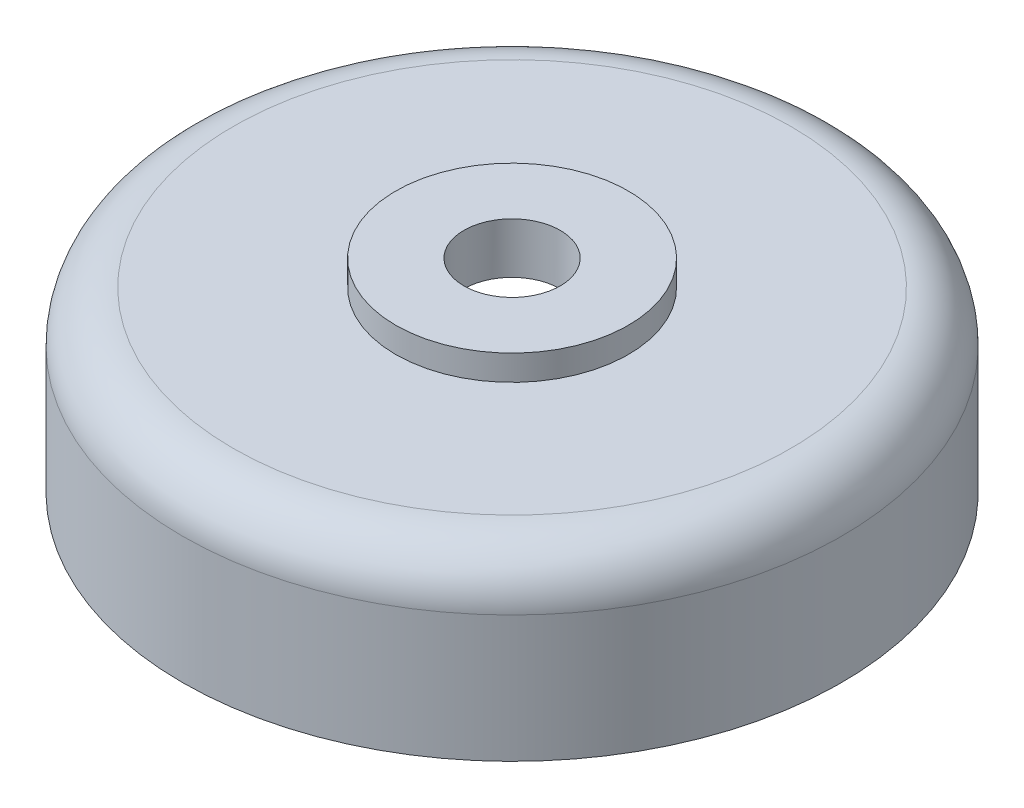
ISO-10303-21;
HEADER;
FILE_DESCRIPTION(('STEP AP214'),'2;1');
FILE_NAME('part.step','',(''),(''),'','','');
FILE_SCHEMA(('AUTOMOTIVE_DESIGN { 1 0 10303 214 1 1 1 1 }'));
ENDSEC;
DATA;
#1=APPLICATION_CONTEXT('core data for automotive mechanical design processes');
#2=APPLICATION_PROTOCOL_DEFINITION('international standard','automotive_design',2000,#1);
#3=PRODUCT_CONTEXT('',#1,'mechanical');
#4=PRODUCT('Part','Part','',(#3));
#5=PRODUCT_RELATED_PRODUCT_CATEGORY('part','',(#4));
#6=PRODUCT_DEFINITION_FORMATION('','',#4);
#7=PRODUCT_DEFINITION_CONTEXT('part definition',#1,'design');
#8=PRODUCT_DEFINITION('design','',#6,#7);
#9=PRODUCT_DEFINITION_SHAPE('','',#8);
#10=(LENGTH_UNIT() NAMED_UNIT(*) SI_UNIT(.MILLI.,.METRE.));
#11=(NAMED_UNIT(*) PLANE_ANGLE_UNIT() SI_UNIT($,.RADIAN.));
#12=(NAMED_UNIT(*) SI_UNIT($,.STERADIAN.) SOLID_ANGLE_UNIT());
#13=UNCERTAINTY_MEASURE_WITH_UNIT(LENGTH_MEASURE(1.E-05),#10,'distance_accuracy_value','');
#14=(GEOMETRIC_REPRESENTATION_CONTEXT(3) GLOBAL_UNCERTAINTY_ASSIGNED_CONTEXT((#13)) GLOBAL_UNIT_ASSIGNED_CONTEXT((#10,
#11,#12)) REPRESENTATION_CONTEXT('',''));
#15=CARTESIAN_POINT('',(0.,0.,0.));
#16=DIRECTION('',(0.,0.,1.));
#17=DIRECTION('',(1.,0.,0.));
#18=AXIS2_PLACEMENT_3D('',#15,#16,#17);
#19=CARTESIAN_POINT('',(0.,-59.,0.));
#20=DIRECTION('',(0.,1.,0.));
#21=DIRECTION('',(0.,0.,1.));
#22=AXIS2_PLACEMENT_3D('',#19,#20,#21);
#23=CYLINDRICAL_SURFACE('',#22,9.5);
#24=CARTESIAN_POINT('',(0.,40.,0.));
#25=DIRECTION('',(0.,1.,0.));
#26=DIRECTION('',(0.,0.,1.));
#27=AXIS2_PLACEMENT_3D('',#24,#25,#26);
#28=CIRCLE('',#27,9.5);
#29=CARTESIAN_POINT('',(0.,40.,9.5));
#30=VERTEX_POINT('',#29);
#31=EDGE_CURVE('E65',#30,#30,#28,.T.);
#32=ORIENTED_EDGE('',*,*,#31,.T.);
#33=EDGE_LOOP('',(#32));
#34=FACE_BOUND('',#33,.T.);
#35=CARTESIAN_POINT('',(0.,30.,0.));
#36=DIRECTION('',(0.,-1.,0.));
#37=DIRECTION('',(0.,0.,-1.));
#38=AXIS2_PLACEMENT_3D('',#35,#36,#37);
#39=CIRCLE('',#38,9.5);
#40=CARTESIAN_POINT('',(0.,30.,-9.5));
#41=VERTEX_POINT('',#40);
#42=EDGE_CURVE('E61',#41,#41,#39,.F.);
#43=ORIENTED_EDGE('',*,*,#42,.F.);
#44=EDGE_LOOP('',(#43));
#45=FACE_BOUND('',#44,.T.);
#46=ADVANCED_FACE('F36',(#34,#45),#23,.F.);
#47=CARTESIAN_POINT('',(0.,35.,0.));
#48=DIRECTION('',(0.,-1.,0.));
#49=DIRECTION('',(0.,0.,-1.));
#50=AXIS2_PLACEMENT_3D('',#47,#48,#49);
#51=CYLINDRICAL_SURFACE('',#50,65.);
#52=CARTESIAN_POINT('',(0.,25.,0.));
#53=DIRECTION('',(0.,1.,0.));
#54=DIRECTION('',(0.,0.,1.));
#55=AXIS2_PLACEMENT_3D('',#52,#53,#54);
#56=CIRCLE('',#55,65.);
#57=CARTESIAN_POINT('',(0.,25.,65.));
#58=VERTEX_POINT('',#57);
#59=EDGE_CURVE('E49',#58,#58,#56,.F.);
#60=ORIENTED_EDGE('',*,*,#59,.T.);
#61=EDGE_LOOP('',(#60));
#62=FACE_BOUND('',#61,.T.);
#63=CARTESIAN_POINT('',(0.,0.,0.));
#64=DIRECTION('',(0.,1.,0.));
#65=DIRECTION('',(0.,0.,1.));
#66=AXIS2_PLACEMENT_3D('',#63,#64,#65);
#67=CIRCLE('',#66,65.);
#68=CARTESIAN_POINT('',(0.,0.,65.));
#69=VERTEX_POINT('',#68);
#70=EDGE_CURVE('E67',#69,#69,#67,.T.);
#71=ORIENTED_EDGE('',*,*,#70,.T.);
#72=EDGE_LOOP('',(#71));
#73=FACE_BOUND('',#72,.T.);
#74=ADVANCED_FACE('F95',(#62,#73),#51,.T.);
#75=CARTESIAN_POINT('',(0.,35.,0.));
#76=DIRECTION('',(0.,1.,0.));
#77=DIRECTION('',(0.,0.,1.));
#78=AXIS2_PLACEMENT_3D('',#75,#76,#77);
#79=PLANE('',#78);
#80=CARTESIAN_POINT('',(0.,35.,0.));
#81=DIRECTION('',(0.,1.,0.));
#82=DIRECTION('',(0.,0.,1.));
#83=AXIS2_PLACEMENT_3D('',#80,#81,#82);
#84=CIRCLE('',#83,55.);
#85=CARTESIAN_POINT('',(0.,35.,55.));
#86=VERTEX_POINT('',#85);
#87=EDGE_CURVE('E54',#86,#86,#84,.T.);
#88=ORIENTED_EDGE('',*,*,#87,.T.);
#89=EDGE_LOOP('',(#88));
#90=FACE_BOUND('',#89,.T.);
#91=CARTESIAN_POINT('',(0.,35.,0.));
#92=DIRECTION('',(0.,1.,0.));
#93=DIRECTION('',(0.,0.,1.));
#94=AXIS2_PLACEMENT_3D('',#91,#92,#93);
#95=CIRCLE('',#94,22.945);
#96=CARTESIAN_POINT('',(0.,35.,22.945));
#97=VERTEX_POINT('',#96);
#98=EDGE_CURVE('E60',#97,#97,#95,.T.);
#99=ORIENTED_EDGE('',*,*,#98,.F.);
#100=EDGE_LOOP('',(#99));
#101=FACE_BOUND('',#100,.T.);
#102=ADVANCED_FACE('F91',(#90,#101),#79,.T.);
#103=CARTESIAN_POINT('',(0.,0.,0.));
#104=DIRECTION('',(0.,1.,0.));
#105=DIRECTION('',(0.,0.,1.));
#106=AXIS2_PLACEMENT_3D('',#103,#104,#105);
#107=PLANE('',#106);
#108=CARTESIAN_POINT('',(0.,0.,0.));
#109=DIRECTION('',(0.,-1.,0.));
#110=DIRECTION('',(0.,0.,-1.));
#111=AXIS2_PLACEMENT_3D('',#108,#109,#110);
#112=CIRCLE('',#111,60.);
#113=CARTESIAN_POINT('',(0.,0.,-60.));
#114=VERTEX_POINT('',#113);
#115=EDGE_CURVE('E66',#114,#114,#112,.T.);
#116=ORIENTED_EDGE('',*,*,#115,.F.);
#117=EDGE_LOOP('',(#116));
#118=FACE_BOUND('',#117,.T.);
#119=ORIENTED_EDGE('',*,*,#70,.F.);
#120=EDGE_LOOP('',(#119));
#121=FACE_BOUND('',#120,.T.);
#122=ADVANCED_FACE('F87',(#118,#121),#107,.F.);
#123=CARTESIAN_POINT('',(0.,40.,0.));
#124=DIRECTION('',(0.,-1.,0.));
#125=DIRECTION('',(0.,0.,-1.));
#126=AXIS2_PLACEMENT_3D('',#123,#124,#125);
#127=CYLINDRICAL_SURFACE('',#126,22.945);
#128=CARTESIAN_POINT('',(0.,40.,0.));
#129=DIRECTION('',(0.,1.,0.));
#130=DIRECTION('',(0.,0.,1.));
#131=AXIS2_PLACEMENT_3D('',#128,#129,#130);
#132=CIRCLE('',#131,22.945);
#133=CARTESIAN_POINT('',(0.,40.,22.945));
#134=VERTEX_POINT('',#133);
#135=EDGE_CURVE('E71',#134,#134,#132,.T.);
#136=ORIENTED_EDGE('',*,*,#135,.F.);
#137=EDGE_LOOP('',(#136));
#138=FACE_BOUND('',#137,.T.);
#139=ORIENTED_EDGE('',*,*,#98,.T.);
#140=EDGE_LOOP('',(#139));
#141=FACE_BOUND('',#140,.T.);
#142=ADVANCED_FACE('F90',(#138,#141),#127,.T.);
#143=CARTESIAN_POINT('',(0.,40.,0.));
#144=DIRECTION('',(0.,1.,0.));
#145=DIRECTION('',(0.,0.,1.));
#146=AXIS2_PLACEMENT_3D('',#143,#144,#145);
#147=PLANE('',#146);
#148=ORIENTED_EDGE('',*,*,#31,.F.);
#149=EDGE_LOOP('',(#148));
#150=FACE_BOUND('',#149,.T.);
#151=ORIENTED_EDGE('',*,*,#135,.T.);
#152=EDGE_LOOP('',(#151));
#153=FACE_BOUND('',#152,.T.);
#154=ADVANCED_FACE('F126',(#150,#153),#147,.T.);
#155=CARTESIAN_POINT('',(0.,30.,0.));
#156=DIRECTION('',(0.,-1.,0.));
#157=DIRECTION('',(0.,0.,-1.));
#158=AXIS2_PLACEMENT_3D('',#155,#156,#157);
#159=PLANE('',#158);
#160=CARTESIAN_POINT('',(0.,30.,0.));
#161=DIRECTION('',(0.,-1.,0.));
#162=DIRECTION('',(0.,0.,-1.));
#163=AXIS2_PLACEMENT_3D('',#160,#161,#162);
#164=CIRCLE('',#163,50.);
#165=CARTESIAN_POINT('',(0.,30.,-50.));
#166=VERTEX_POINT('',#165);
#167=EDGE_CURVE('E44',#166,#166,#164,.T.);
#168=ORIENTED_EDGE('',*,*,#167,.T.);
#169=EDGE_LOOP('',(#168));
#170=FACE_BOUND('',#169,.T.);
#171=ORIENTED_EDGE('',*,*,#42,.T.);
#172=EDGE_LOOP('',(#171));
#173=FACE_BOUND('',#172,.T.);
#174=ADVANCED_FACE('F117',(#170,#173),#159,.T.);
#175=CARTESIAN_POINT('',(0.,30.,0.));
#176=DIRECTION('',(0.,-1.,0.));
#177=DIRECTION('',(0.,0.,-1.));
#178=AXIS2_PLACEMENT_3D('',#175,#176,#177);
#179=CYLINDRICAL_SURFACE('',#178,60.);
#180=CARTESIAN_POINT('',(0.,20.,0.));
#181=DIRECTION('',(0.,-1.,0.));
#182=DIRECTION('',(0.,0.,-1.));
#183=AXIS2_PLACEMENT_3D('',#180,#181,#182);
#184=CIRCLE('',#183,60.);
#185=CARTESIAN_POINT('',(0.,20.,-60.));
#186=VERTEX_POINT('',#185);
#187=EDGE_CURVE('E10',#186,#186,#184,.F.);
#188=ORIENTED_EDGE('',*,*,#187,.T.);
#189=EDGE_LOOP('',(#188));
#190=FACE_BOUND('',#189,.T.);
#191=ORIENTED_EDGE('',*,*,#115,.T.);
#192=EDGE_LOOP('',(#191));
#193=FACE_BOUND('',#192,.T.);
#194=ADVANCED_FACE('F85',(#190,#193),#179,.F.);
#195=CARTESIAN_POINT('',(0.,25.,0.));
#196=DIRECTION('',(0.,1.,0.));
#197=DIRECTION('',(0.,0.,1.));
#198=AXIS2_PLACEMENT_3D('',#195,#196,#197);
#199=TOROIDAL_SURFACE('',#198,55.,10.);
#200=ORIENTED_EDGE('',*,*,#59,.F.);
#201=EDGE_LOOP('',(#200));
#202=FACE_BOUND('',#201,.T.);
#203=ORIENTED_EDGE('',*,*,#87,.F.);
#204=EDGE_LOOP('',(#203));
#205=FACE_BOUND('',#204,.T.);
#206=ADVANCED_FACE('F108',(#202,#205),#199,.T.);
#207=CARTESIAN_POINT('',(0.,20.,0.));
#208=DIRECTION('',(0.,-1.,0.));
#209=DIRECTION('',(0.,0.,-1.));
#210=AXIS2_PLACEMENT_3D('',#207,#208,#209);
#211=TOROIDAL_SURFACE('',#210,50.,10.);
#212=ORIENTED_EDGE('',*,*,#187,.F.);
#213=EDGE_LOOP('',(#212));
#214=FACE_BOUND('',#213,.T.);
#215=ORIENTED_EDGE('',*,*,#167,.F.);
#216=EDGE_LOOP('',(#215));
#217=FACE_BOUND('',#216,.T.);
#218=ADVANCED_FACE('F38',(#214,#217),#211,.F.);
#219=CLOSED_SHELL('',(#46,#74,#102,#122,#142,#154,#174,#194,#206,#218));
#220=MANIFOLD_SOLID_BREP('B2',#219);
#221=ADVANCED_BREP_SHAPE_REPRESENTATION('',(#18,#220),#14);
#222=SHAPE_DEFINITION_REPRESENTATION(#9,#221);
ENDSEC;
END-ISO-10303-21;
